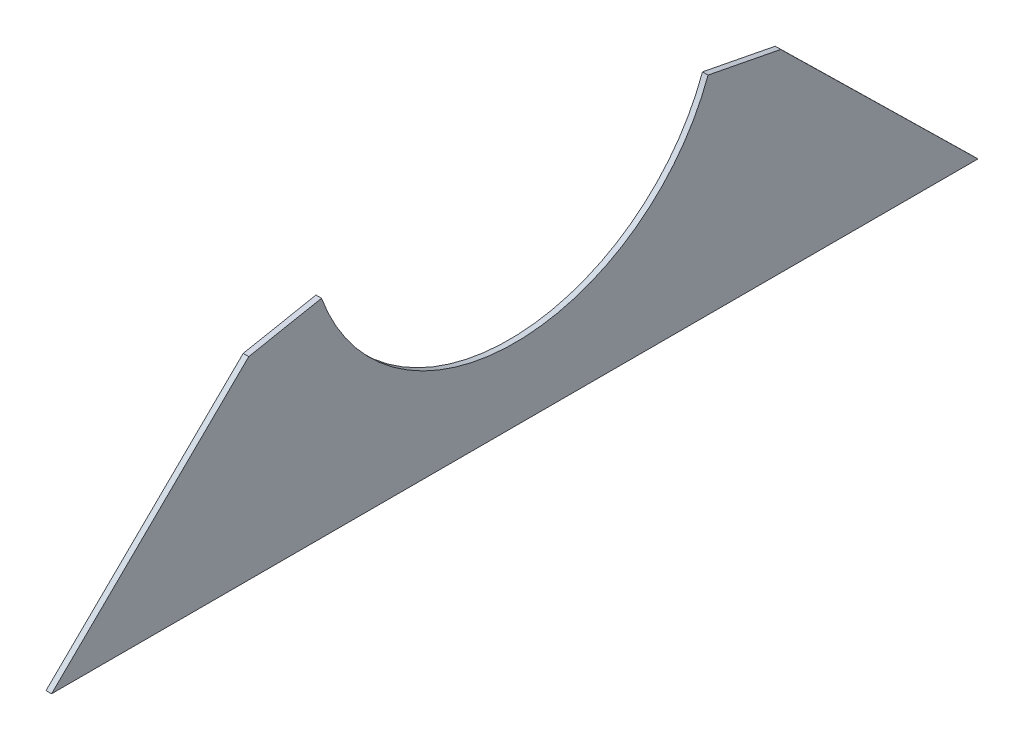
ISO-10303-21;
HEADER;
FILE_DESCRIPTION(('STEP AP214'),'2;1');
FILE_NAME('part.step','',(''),(''),'','','');
FILE_SCHEMA(('AUTOMOTIVE_DESIGN { 1 0 10303 214 1 1 1 1 }'));
ENDSEC;
DATA;
#1=APPLICATION_CONTEXT('core data for automotive mechanical design processes');
#2=APPLICATION_PROTOCOL_DEFINITION('international standard','automotive_design',2000,#1);
#3=PRODUCT_CONTEXT('',#1,'mechanical');
#4=PRODUCT('Part','Part','',(#3));
#5=PRODUCT_RELATED_PRODUCT_CATEGORY('part','',(#4));
#6=PRODUCT_DEFINITION_FORMATION('','',#4);
#7=PRODUCT_DEFINITION_CONTEXT('part definition',#1,'design');
#8=PRODUCT_DEFINITION('design','',#6,#7);
#9=PRODUCT_DEFINITION_SHAPE('','',#8);
#10=(LENGTH_UNIT() NAMED_UNIT(*) SI_UNIT(.MILLI.,.METRE.));
#11=(NAMED_UNIT(*) PLANE_ANGLE_UNIT() SI_UNIT($,.RADIAN.));
#12=(NAMED_UNIT(*) SI_UNIT($,.STERADIAN.) SOLID_ANGLE_UNIT());
#13=UNCERTAINTY_MEASURE_WITH_UNIT(LENGTH_MEASURE(1.E-05),#10,'distance_accuracy_value','');
#14=(GEOMETRIC_REPRESENTATION_CONTEXT(3) GLOBAL_UNCERTAINTY_ASSIGNED_CONTEXT((#13)) GLOBAL_UNIT_ASSIGNED_CONTEXT((#10,
#11,#12)) REPRESENTATION_CONTEXT('',''));
#15=CARTESIAN_POINT('',(0.,0.,0.));
#16=DIRECTION('',(0.,0.,1.));
#17=DIRECTION('',(1.,0.,0.));
#18=AXIS2_PLACEMENT_3D('',#15,#16,#17);
#19=CARTESIAN_POINT('',(-3.,-45.5965957242111,-143.570968245142));
#20=DIRECTION('',(0.,0.713867546087755,-0.70028074844497));
#21=DIRECTION('',(0.,0.70028074844497,0.713867546087755));
#22=AXIS2_PLACEMENT_3D('',#19,#20,#21);
#23=PLANE('',#22);
#24=DIRECTION('',(0.,0.70028074844497,0.713867546087755));
#25=VECTOR('',#24,1.);
#26=CARTESIAN_POINT('',(0.,-45.5965957242111,-143.570968245142));
#27=LINE('',#26,#25);
#28=CARTESIAN_POINT('',(0.,-150.,-250.));
#29=VERTEX_POINT('',#28);
#30=CARTESIAN_POINT('',(0.,-45.5965957242111,-143.570968245142));
#31=VERTEX_POINT('',#30);
#32=EDGE_CURVE('E143',#29,#31,#27,.T.);
#33=ORIENTED_EDGE('',*,*,#32,.F.);
#34=DIRECTION('',(1.,0.,0.));
#35=VECTOR('',#34,1.);
#36=CARTESIAN_POINT('',(-3.,-150.,-250.));
#37=LINE('',#36,#35);
#38=CARTESIAN_POINT('',(-3.,-150.,-250.));
#39=VERTEX_POINT('',#38);
#40=EDGE_CURVE('E11',#39,#29,#37,.T.);
#41=ORIENTED_EDGE('',*,*,#40,.F.);
#42=DIRECTION('',(0.,0.70028074844497,0.713867546087755));
#43=VECTOR('',#42,1.);
#44=CARTESIAN_POINT('',(-3.,-45.5965957242111,-143.570968245142));
#45=LINE('',#44,#43);
#46=CARTESIAN_POINT('',(-3.,-45.5965957242111,-143.570968245142));
#47=VERTEX_POINT('',#46);
#48=EDGE_CURVE('E163',#39,#47,#45,.T.);
#49=ORIENTED_EDGE('',*,*,#48,.T.);
#50=DIRECTION('',(1.,0.,0.));
#51=VECTOR('',#50,1.);
#52=CARTESIAN_POINT('',(-3.,-45.5965957242111,-143.570968245142));
#53=LINE('',#52,#51);
#54=EDGE_CURVE('E54',#47,#31,#53,.T.);
#55=ORIENTED_EDGE('',*,*,#54,.T.);
#56=EDGE_LOOP('',(#33,#41,#49,#55));
#57=FACE_BOUND('',#56,.T.);
#58=ADVANCED_FACE('F51',(#57),#23,.T.);
#59=CARTESIAN_POINT('',(-3.,-150.,-250.));
#60=DIRECTION('',(0.,-1.,0.));
#61=DIRECTION('',(0.,0.,-1.));
#62=AXIS2_PLACEMENT_3D('',#59,#60,#61);
#63=PLANE('',#62);
#64=DIRECTION('',(0.,0.,-1.));
#65=VECTOR('',#64,1.);
#66=CARTESIAN_POINT('',(0.,-150.,-250.));
#67=LINE('',#66,#65);
#68=CARTESIAN_POINT('',(0.,-150.,250.));
#69=VERTEX_POINT('',#68);
#70=EDGE_CURVE('E160',#69,#29,#67,.T.);
#71=ORIENTED_EDGE('',*,*,#70,.F.);
#72=DIRECTION('',(1.,0.,0.));
#73=VECTOR('',#72,1.);
#74=CARTESIAN_POINT('',(-3.,-150.,250.));
#75=LINE('',#74,#73);
#76=CARTESIAN_POINT('',(-3.,-150.,250.));
#77=VERTEX_POINT('',#76);
#78=EDGE_CURVE('E61',#77,#69,#75,.T.);
#79=ORIENTED_EDGE('',*,*,#78,.F.);
#80=DIRECTION('',(0.,0.,-1.));
#81=VECTOR('',#80,1.);
#82=CARTESIAN_POINT('',(-3.,-150.,-250.));
#83=LINE('',#82,#81);
#84=EDGE_CURVE('E128',#77,#39,#83,.T.);
#85=ORIENTED_EDGE('',*,*,#84,.T.);
#86=ORIENTED_EDGE('',*,*,#40,.T.);
#87=EDGE_LOOP('',(#71,#79,#85,#86));
#88=FACE_BOUND('',#87,.T.);
#89=ADVANCED_FACE('F177',(#88),#63,.T.);
#90=CARTESIAN_POINT('',(-3.,-45.5965957242111,143.570968245142));
#91=DIRECTION('',(0.,0.713867546087754,0.70028074844497));
#92=DIRECTION('',(0.,-0.70028074844497,0.713867546087754));
#93=AXIS2_PLACEMENT_3D('',#90,#91,#92);
#94=PLANE('',#93);
#95=DIRECTION('',(0.,-0.70028074844497,0.713867546087754));
#96=VECTOR('',#95,1.);
#97=CARTESIAN_POINT('',(0.,-45.5965957242111,143.570968245142));
#98=LINE('',#97,#96);
#99=CARTESIAN_POINT('',(0.,-45.5965957242111,143.570968245142));
#100=VERTEX_POINT('',#99);
#101=EDGE_CURVE('E114',#100,#69,#98,.T.);
#102=ORIENTED_EDGE('',*,*,#101,.F.);
#103=DIRECTION('',(1.,0.,0.));
#104=VECTOR('',#103,1.);
#105=CARTESIAN_POINT('',(-3.,-45.5965957242111,143.570968245142));
#106=LINE('',#105,#104);
#107=CARTESIAN_POINT('',(-3.,-45.5965957242111,143.570968245142));
#108=VERTEX_POINT('',#107);
#109=EDGE_CURVE('E109',#108,#100,#106,.T.);
#110=ORIENTED_EDGE('',*,*,#109,.F.);
#111=DIRECTION('',(0.,-0.70028074844497,0.713867546087754));
#112=VECTOR('',#111,1.);
#113=CARTESIAN_POINT('',(-3.,-45.5965957242111,143.570968245142));
#114=LINE('',#113,#112);
#115=EDGE_CURVE('E112',#108,#77,#114,.T.);
#116=ORIENTED_EDGE('',*,*,#115,.T.);
#117=ORIENTED_EDGE('',*,*,#78,.T.);
#118=EDGE_LOOP('',(#102,#110,#116,#117));
#119=FACE_BOUND('',#118,.T.);
#120=ADVANCED_FACE('F111',(#119),#94,.T.);
#121=CARTESIAN_POINT('',(-3.,-37.9642359091493,104.305880907236));
#122=DIRECTION('',(0.,0.981627183447664,0.190808995376544));
#123=DIRECTION('',(0.,-0.190808995376544,0.981627183447664));
#124=AXIS2_PLACEMENT_3D('',#121,#122,#123);
#125=PLANE('',#124);
#126=DIRECTION('',(0.,-0.190808995376544,0.981627183447664));
#127=VECTOR('',#126,1.);
#128=CARTESIAN_POINT('',(0.,-37.9642359091493,104.305880907236));
#129=LINE('',#128,#127);
#130=CARTESIAN_POINT('',(0.,-37.9642359091493,104.305880907236));
#131=VERTEX_POINT('',#130);
#132=EDGE_CURVE('E155',#131,#100,#129,.T.);
#133=ORIENTED_EDGE('',*,*,#132,.F.);
#134=DIRECTION('',(1.,0.,0.));
#135=VECTOR('',#134,1.);
#136=CARTESIAN_POINT('',(-3.,-37.9642359091493,104.305880907236));
#137=LINE('',#136,#135);
#138=CARTESIAN_POINT('',(-3.,-37.9642359091493,104.305880907236));
#139=VERTEX_POINT('',#138);
#140=EDGE_CURVE('E120',#139,#131,#137,.T.);
#141=ORIENTED_EDGE('',*,*,#140,.F.);
#142=DIRECTION('',(0.,-0.190808995376544,0.981627183447664));
#143=VECTOR('',#142,1.);
#144=CARTESIAN_POINT('',(-3.,-37.9642359091493,104.305880907236));
#145=LINE('',#144,#143);
#146=EDGE_CURVE('E126',#139,#108,#145,.T.);
#147=ORIENTED_EDGE('',*,*,#146,.T.);
#148=ORIENTED_EDGE('',*,*,#109,.T.);
#149=EDGE_LOOP('',(#133,#141,#147,#148));
#150=FACE_BOUND('',#149,.T.);
#151=ADVANCED_FACE('F131',(#150),#125,.T.);
#152=CARTESIAN_POINT('',(-3.,0.,0.));
#153=DIRECTION('',(1.,0.,0.));
#154=DIRECTION('',(0.,0.,-1.));
#155=AXIS2_PLACEMENT_3D('',#152,#153,#154);
#156=CYLINDRICAL_SURFACE('',#155,111.);
#157=CARTESIAN_POINT('',(0.,0.,0.));
#158=DIRECTION('',(-1.,0.,0.));
#159=DIRECTION('',(0.,0.,-1.));
#160=AXIS2_PLACEMENT_3D('',#157,#158,#159);
#161=CIRCLE('',#160,111.);
#162=CARTESIAN_POINT('',(0.,-37.9642359091493,-104.305880907236));
#163=VERTEX_POINT('',#162);
#164=EDGE_CURVE('E151',#163,#131,#161,.T.);
#165=ORIENTED_EDGE('',*,*,#164,.F.);
#166=DIRECTION('',(1.,0.,0.));
#167=VECTOR('',#166,1.);
#168=CARTESIAN_POINT('',(-3.,-37.9642359091493,-104.305880907236));
#169=LINE('',#168,#167);
#170=CARTESIAN_POINT('',(-3.,-37.9642359091493,-104.305880907236));
#171=VERTEX_POINT('',#170);
#172=EDGE_CURVE('E168',#171,#163,#169,.T.);
#173=ORIENTED_EDGE('',*,*,#172,.F.);
#174=CARTESIAN_POINT('',(-3.,0.,0.));
#175=DIRECTION('',(-1.,0.,0.));
#176=DIRECTION('',(0.,0.,-1.));
#177=AXIS2_PLACEMENT_3D('',#174,#175,#176);
#178=CIRCLE('',#177,111.);
#179=EDGE_CURVE('E133',#171,#139,#178,.T.);
#180=ORIENTED_EDGE('',*,*,#179,.T.);
#181=ORIENTED_EDGE('',*,*,#140,.T.);
#182=EDGE_LOOP('',(#165,#173,#180,#181));
#183=FACE_BOUND('',#182,.T.);
#184=ADVANCED_FACE('F190',(#183),#156,.F.);
#185=CARTESIAN_POINT('',(-3.,-37.9642359091493,-104.305880907236));
#186=DIRECTION('',(0.,0.981627183447664,-0.190808995376544));
#187=DIRECTION('',(0.,0.190808995376544,0.981627183447664));
#188=AXIS2_PLACEMENT_3D('',#185,#186,#187);
#189=PLANE('',#188);
#190=DIRECTION('',(0.,0.190808995376544,0.981627183447664));
#191=VECTOR('',#190,1.);
#192=CARTESIAN_POINT('',(0.,-37.9642359091493,-104.305880907236));
#193=LINE('',#192,#191);
#194=EDGE_CURVE('E147',#31,#163,#193,.T.);
#195=ORIENTED_EDGE('',*,*,#194,.F.);
#196=ORIENTED_EDGE('',*,*,#54,.F.);
#197=DIRECTION('',(0.,0.190808995376544,0.981627183447664));
#198=VECTOR('',#197,1.);
#199=CARTESIAN_POINT('',(-3.,-37.9642359091493,-104.305880907236));
#200=LINE('',#199,#198);
#201=EDGE_CURVE('E137',#47,#171,#200,.T.);
#202=ORIENTED_EDGE('',*,*,#201,.T.);
#203=ORIENTED_EDGE('',*,*,#172,.T.);
#204=EDGE_LOOP('',(#195,#196,#202,#203));
#205=FACE_BOUND('',#204,.T.);
#206=ADVANCED_FACE('F174',(#205),#189,.T.);
#207=CARTESIAN_POINT('',(-3.,0.,0.));
#208=DIRECTION('',(1.,0.,0.));
#209=DIRECTION('',(0.,0.,-1.));
#210=AXIS2_PLACEMENT_3D('',#207,#208,#209);
#211=PLANE('',#210);
#212=ORIENTED_EDGE('',*,*,#48,.F.);
#213=ORIENTED_EDGE('',*,*,#84,.F.);
#214=ORIENTED_EDGE('',*,*,#115,.F.);
#215=ORIENTED_EDGE('',*,*,#146,.F.);
#216=ORIENTED_EDGE('',*,*,#179,.F.);
#217=ORIENTED_EDGE('',*,*,#201,.F.);
#218=EDGE_LOOP('',(#212,#213,#214,#215,#216,#217));
#219=FACE_BOUND('',#218,.T.);
#220=ADVANCED_FACE('F124',(#219),#211,.F.);
#221=CARTESIAN_POINT('',(0.,0.,0.));
#222=DIRECTION('',(1.,0.,0.));
#223=DIRECTION('',(0.,0.,-1.));
#224=AXIS2_PLACEMENT_3D('',#221,#222,#223);
#225=PLANE('',#224);
#226=ORIENTED_EDGE('',*,*,#32,.T.);
#227=ORIENTED_EDGE('',*,*,#194,.T.);
#228=ORIENTED_EDGE('',*,*,#164,.T.);
#229=ORIENTED_EDGE('',*,*,#132,.T.);
#230=ORIENTED_EDGE('',*,*,#101,.T.);
#231=ORIENTED_EDGE('',*,*,#70,.T.);
#232=EDGE_LOOP('',(#226,#227,#228,#229,#230,#231));
#233=FACE_BOUND('',#232,.T.);
#234=ADVANCED_FACE('F176',(#233),#225,.T.);
#235=CLOSED_SHELL('',(#58,#89,#120,#151,#184,#206,#220,#234));
#236=MANIFOLD_SOLID_BREP('B2',#235);
#237=ADVANCED_BREP_SHAPE_REPRESENTATION('',(#18,#236),#14);
#238=SHAPE_DEFINITION_REPRESENTATION(#9,#237);
ENDSEC;
END-ISO-10303-21;
